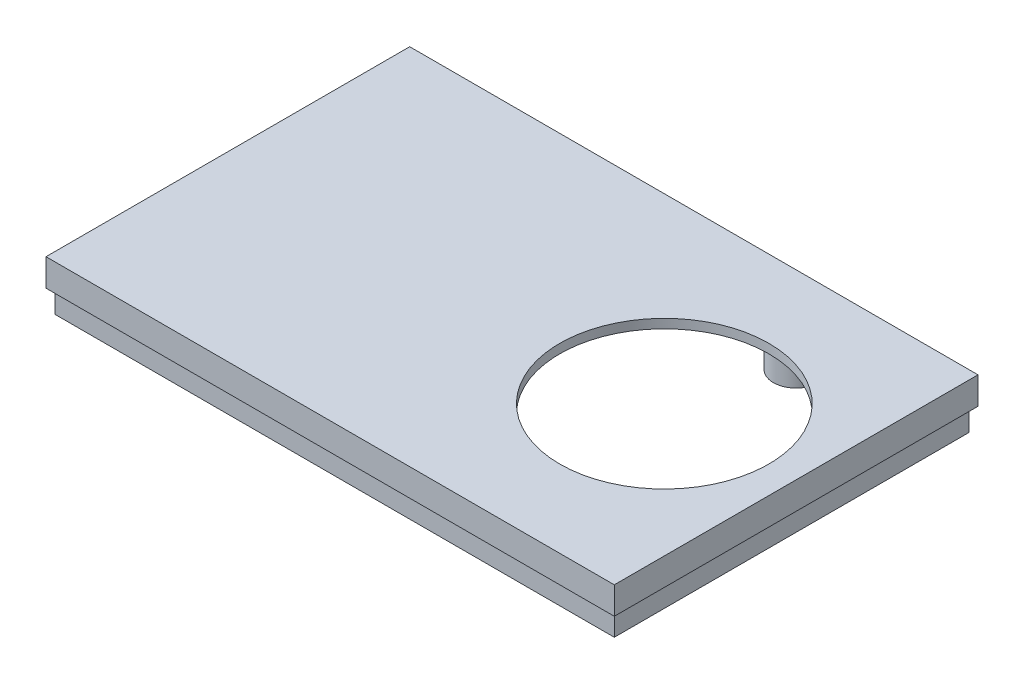
ISO-10303-21;
HEADER;
FILE_DESCRIPTION(('STEP AP214'),'2;1');
FILE_NAME('part.step','',(''),(''),'','','');
FILE_SCHEMA(('AUTOMOTIVE_DESIGN { 1 0 10303 214 1 1 1 1 }'));
ENDSEC;
DATA;
#1=APPLICATION_CONTEXT('core data for automotive mechanical design processes');
#2=APPLICATION_PROTOCOL_DEFINITION('international standard','automotive_design',2000,#1);
#3=PRODUCT_CONTEXT('',#1,'mechanical');
#4=PRODUCT('Part','Part','',(#3));
#5=PRODUCT_RELATED_PRODUCT_CATEGORY('part','',(#4));
#6=PRODUCT_DEFINITION_FORMATION('','',#4);
#7=PRODUCT_DEFINITION_CONTEXT('part definition',#1,'design');
#8=PRODUCT_DEFINITION('design','',#6,#7);
#9=PRODUCT_DEFINITION_SHAPE('','',#8);
#10=(LENGTH_UNIT() NAMED_UNIT(*) SI_UNIT(.MILLI.,.METRE.));
#11=(NAMED_UNIT(*) PLANE_ANGLE_UNIT() SI_UNIT($,.RADIAN.));
#12=(NAMED_UNIT(*) SI_UNIT($,.STERADIAN.) SOLID_ANGLE_UNIT());
#13=UNCERTAINTY_MEASURE_WITH_UNIT(LENGTH_MEASURE(1.E-05),#10,'distance_accuracy_value','');
#14=(GEOMETRIC_REPRESENTATION_CONTEXT(3) GLOBAL_UNCERTAINTY_ASSIGNED_CONTEXT((#13)) GLOBAL_UNIT_ASSIGNED_CONTEXT((#10,
#11,#12)) REPRESENTATION_CONTEXT('',''));
#15=CARTESIAN_POINT('',(0.,0.,0.));
#16=DIRECTION('',(0.,0.,1.));
#17=DIRECTION('',(1.,0.,0.));
#18=AXIS2_PLACEMENT_3D('',#15,#16,#17);
#19=CARTESIAN_POINT('',(-39.2790697674419,5.5,-6.65116279069767));
#20=DIRECTION('',(0.,0.,1.));
#21=DIRECTION('',(1.,0.,0.));
#22=AXIS2_PLACEMENT_3D('',#19,#20,#21);
#23=PLANE('',#22);
#24=DIRECTION('',(-1.,0.,0.));
#25=VECTOR('',#24,1.);
#26=CARTESIAN_POINT('',(22.7209302325581,2.5,-6.65116279069767));
#27=LINE('',#26,#25);
#28=CARTESIAN_POINT('',(22.2209302325581,2.5,-6.65116279069767));
#29=VERTEX_POINT('',#28);
#30=CARTESIAN_POINT('',(-39.2790697674419,2.5,-6.65116279069767));
#31=VERTEX_POINT('',#30);
#32=EDGE_CURVE('E58',#29,#31,#27,.T.);
#33=ORIENTED_EDGE('',*,*,#32,.F.);
#34=DIRECTION('',(0.,-1.,0.));
#35=VECTOR('',#34,1.);
#36=CARTESIAN_POINT('',(22.2209302325581,5.5,-6.65116279069767));
#37=LINE('',#36,#35);
#38=CARTESIAN_POINT('',(22.2209302325581,0.,-6.65116279069767));
#39=VERTEX_POINT('',#38);
#40=EDGE_CURVE('E222',#29,#39,#37,.T.);
#41=ORIENTED_EDGE('',*,*,#40,.T.);
#42=DIRECTION('',(-1.,0.,0.));
#43=VECTOR('',#42,1.);
#44=CARTESIAN_POINT('',(-39.2790697674419,0.,-6.65116279069767));
#45=LINE('',#44,#43);
#46=CARTESIAN_POINT('',(-39.2790697674419,0.,-6.65116279069767));
#47=VERTEX_POINT('',#46);
#48=EDGE_CURVE('E217',#39,#47,#45,.T.);
#49=ORIENTED_EDGE('',*,*,#48,.T.);
#50=DIRECTION('',(0.,-1.,0.));
#51=VECTOR('',#50,1.);
#52=CARTESIAN_POINT('',(-39.2790697674419,5.5,-6.65116279069767));
#53=LINE('',#52,#51);
#54=EDGE_CURVE('E220',#31,#47,#53,.T.);
#55=ORIENTED_EDGE('',*,*,#54,.F.);
#56=EDGE_LOOP('',(#33,#41,#49,#55));
#57=FACE_BOUND('',#56,.T.);
#58=ADVANCED_FACE('F35',(#57),#23,.F.);
#59=CARTESIAN_POINT('',(22.2209302325581,5.5,-6.65116279069767));
#60=DIRECTION('',(-1.,0.,0.));
#61=DIRECTION('',(0.,0.,1.));
#62=AXIS2_PLACEMENT_3D('',#59,#60,#61);
#63=PLANE('',#62);
#64=DIRECTION('',(0.,0.,-1.));
#65=VECTOR('',#64,1.);
#66=CARTESIAN_POINT('',(22.2209302325581,2.5,32.8488372093023));
#67=LINE('',#66,#65);
#68=CARTESIAN_POINT('',(22.2209302325581,2.5,32.3488372093023));
#69=VERTEX_POINT('',#68);
#70=EDGE_CURVE('E181',#69,#29,#67,.T.);
#71=ORIENTED_EDGE('',*,*,#70,.F.);
#72=DIRECTION('',(0.,-1.,0.));
#73=VECTOR('',#72,1.);
#74=CARTESIAN_POINT('',(22.2209302325581,5.5,32.3488372093023));
#75=LINE('',#74,#73);
#76=CARTESIAN_POINT('',(22.2209302325581,0.,32.3488372093023));
#77=VERTEX_POINT('',#76);
#78=EDGE_CURVE('E224',#69,#77,#75,.T.);
#79=ORIENTED_EDGE('',*,*,#78,.T.);
#80=DIRECTION('',(0.,0.,-1.));
#81=VECTOR('',#80,1.);
#82=CARTESIAN_POINT('',(22.2209302325581,0.,-6.65116279069767));
#83=LINE('',#82,#81);
#84=EDGE_CURVE('E214',#77,#39,#83,.T.);
#85=ORIENTED_EDGE('',*,*,#84,.T.);
#86=ORIENTED_EDGE('',*,*,#40,.F.);
#87=EDGE_LOOP('',(#71,#79,#85,#86));
#88=FACE_BOUND('',#87,.T.);
#89=ADVANCED_FACE('F293',(#88),#63,.F.);
#90=CARTESIAN_POINT('',(-39.2790697674419,5.5,32.3488372093023));
#91=DIRECTION('',(0.,0.,-1.));
#92=DIRECTION('',(-1.,0.,0.));
#93=AXIS2_PLACEMENT_3D('',#90,#91,#92);
#94=PLANE('',#93);
#95=DIRECTION('',(1.,0.,0.));
#96=VECTOR('',#95,1.);
#97=CARTESIAN_POINT('',(-39.7790697674419,2.5,32.3488372093023));
#98=LINE('',#97,#96);
#99=CARTESIAN_POINT('',(-39.2790697674419,2.5,32.3488372093023));
#100=VERTEX_POINT('',#99);
#101=EDGE_CURVE('E191',#100,#69,#98,.T.);
#102=ORIENTED_EDGE('',*,*,#101,.F.);
#103=DIRECTION('',(0.,-1.,0.));
#104=VECTOR('',#103,1.);
#105=CARTESIAN_POINT('',(-39.2790697674419,5.5,32.3488372093023));
#106=LINE('',#105,#104);
#107=CARTESIAN_POINT('',(-39.2790697674419,0.,32.3488372093023));
#108=VERTEX_POINT('',#107);
#109=EDGE_CURVE('E202',#100,#108,#106,.T.);
#110=ORIENTED_EDGE('',*,*,#109,.T.);
#111=DIRECTION('',(1.,0.,0.));
#112=VECTOR('',#111,1.);
#113=CARTESIAN_POINT('',(-39.2790697674419,0.,32.3488372093023));
#114=LINE('',#113,#112);
#115=EDGE_CURVE('E211',#108,#77,#114,.T.);
#116=ORIENTED_EDGE('',*,*,#115,.T.);
#117=ORIENTED_EDGE('',*,*,#78,.F.);
#118=EDGE_LOOP('',(#102,#110,#116,#117));
#119=FACE_BOUND('',#118,.T.);
#120=ADVANCED_FACE('F299',(#119),#94,.F.);
#121=CARTESIAN_POINT('',(-39.2790697674419,5.5,-6.65116279069767));
#122=DIRECTION('',(1.,0.,0.));
#123=DIRECTION('',(0.,0.,-1.));
#124=AXIS2_PLACEMENT_3D('',#121,#122,#123);
#125=PLANE('',#124);
#126=DIRECTION('',(0.,0.,1.));
#127=VECTOR('',#126,1.);
#128=CARTESIAN_POINT('',(-39.2790697674419,2.5,-6.65116279069766));
#129=LINE('',#128,#127);
#130=EDGE_CURVE('E199',#31,#100,#129,.T.);
#131=ORIENTED_EDGE('',*,*,#130,.F.);
#132=ORIENTED_EDGE('',*,*,#54,.T.);
#133=DIRECTION('',(0.,0.,1.));
#134=VECTOR('',#133,1.);
#135=CARTESIAN_POINT('',(-39.2790697674419,0.,-6.65116279069767));
#136=LINE('',#135,#134);
#137=EDGE_CURVE('E207',#47,#108,#136,.T.);
#138=ORIENTED_EDGE('',*,*,#137,.T.);
#139=ORIENTED_EDGE('',*,*,#109,.F.);
#140=EDGE_LOOP('',(#131,#132,#138,#139));
#141=FACE_BOUND('',#140,.T.);
#142=ADVANCED_FACE('F37',(#141),#125,.F.);
#143=CARTESIAN_POINT('',(0.,5.5,0.));
#144=DIRECTION('',(0.,1.,0.));
#145=DIRECTION('',(0.,0.,1.));
#146=AXIS2_PLACEMENT_3D('',#143,#144,#145);
#147=PLANE('',#146);
#148=CARTESIAN_POINT('',(8.22093023255814,5.5,12.8488372093023));
#149=DIRECTION('',(0.,1.,0.));
#150=DIRECTION('',(0.,0.,1.));
#151=AXIS2_PLACEMENT_3D('',#148,#149,#150);
#152=CIRCLE('',#151,11.5);
#153=CARTESIAN_POINT('',(8.22093023255814,5.5,24.3488372093023));
#154=VERTEX_POINT('',#153);
#155=EDGE_CURVE('E151',#154,#154,#152,.T.);
#156=ORIENTED_EDGE('',*,*,#155,.F.);
#157=EDGE_LOOP('',(#156));
#158=FACE_BOUND('',#157,.T.);
#159=DIRECTION('',(0.,0.,1.));
#160=VECTOR('',#159,1.);
#161=CARTESIAN_POINT('',(22.7209302325581,5.5,32.8488372093023));
#162=LINE('',#161,#160);
#163=CARTESIAN_POINT('',(22.7209302325581,5.5,-7.15116279069767));
#164=VERTEX_POINT('',#163);
#165=CARTESIAN_POINT('',(22.7209302325581,5.5,32.8488372093023));
#166=VERTEX_POINT('',#165);
#167=EDGE_CURVE('E186',#164,#166,#162,.T.);
#168=ORIENTED_EDGE('',*,*,#167,.F.);
#169=DIRECTION('',(1.,0.,0.));
#170=VECTOR('',#169,1.);
#171=CARTESIAN_POINT('',(22.7209302325581,5.5,-7.15116279069767));
#172=LINE('',#171,#170);
#173=CARTESIAN_POINT('',(-39.7790697674419,5.5,-7.15116279069767));
#174=VERTEX_POINT('',#173);
#175=EDGE_CURVE('E176',#174,#164,#172,.T.);
#176=ORIENTED_EDGE('',*,*,#175,.F.);
#177=DIRECTION('',(0.,0.,-1.));
#178=VECTOR('',#177,1.);
#179=CARTESIAN_POINT('',(-39.7790697674419,5.5,-6.65116279069766));
#180=LINE('',#179,#178);
#181=CARTESIAN_POINT('',(-39.7790697674419,5.5,32.8488372093023));
#182=VERTEX_POINT('',#181);
#183=EDGE_CURVE('E205',#182,#174,#180,.T.);
#184=ORIENTED_EDGE('',*,*,#183,.F.);
#185=DIRECTION('',(-1.,0.,0.));
#186=VECTOR('',#185,1.);
#187=CARTESIAN_POINT('',(-39.7790697674419,5.5,32.8488372093023));
#188=LINE('',#187,#186);
#189=EDGE_CURVE('E196',#166,#182,#188,.T.);
#190=ORIENTED_EDGE('',*,*,#189,.F.);
#191=EDGE_LOOP('',(#168,#176,#184,#190));
#192=FACE_BOUND('',#191,.T.);
#193=ADVANCED_FACE('F310',(#158,#192),#147,.T.);
#194=CARTESIAN_POINT('',(0.,0.,0.));
#195=DIRECTION('',(0.,1.,0.));
#196=DIRECTION('',(0.,0.,1.));
#197=AXIS2_PLACEMENT_3D('',#194,#195,#196);
#198=PLANE('',#197);
#199=DIRECTION('',(1.,0.,0.));
#200=VECTOR('',#199,1.);
#201=CARTESIAN_POINT('',(-38.7790697674419,0.,-6.15116279069767));
#202=LINE('',#201,#200);
#203=CARTESIAN_POINT('',(-38.7790697674419,0.,-6.15116279069767));
#204=VERTEX_POINT('',#203);
#205=CARTESIAN_POINT('',(21.7209302325581,0.,-6.15116279069767));
#206=VERTEX_POINT('',#205);
#207=EDGE_CURVE('E157',#204,#206,#202,.T.);
#208=ORIENTED_EDGE('',*,*,#207,.F.);
#209=DIRECTION('',(0.,0.,-1.));
#210=VECTOR('',#209,1.);
#211=CARTESIAN_POINT('',(-38.7790697674419,0.,31.8488372093023));
#212=LINE('',#211,#210);
#213=CARTESIAN_POINT('',(-38.7790697674419,0.,31.8488372093023));
#214=VERTEX_POINT('',#213);
#215=EDGE_CURVE('E50',#214,#204,#212,.T.);
#216=ORIENTED_EDGE('',*,*,#215,.F.);
#217=DIRECTION('',(-1.,0.,0.));
#218=VECTOR('',#217,1.);
#219=CARTESIAN_POINT('',(-38.7790697674419,0.,31.8488372093023));
#220=LINE('',#219,#218);
#221=CARTESIAN_POINT('',(21.7209302325581,0.,31.8488372093023));
#222=VERTEX_POINT('',#221);
#223=EDGE_CURVE('E145',#222,#214,#220,.T.);
#224=ORIENTED_EDGE('',*,*,#223,.F.);
#225=DIRECTION('',(0.,0.,1.));
#226=VECTOR('',#225,1.);
#227=CARTESIAN_POINT('',(21.7209302325581,0.,31.8488372093023));
#228=LINE('',#227,#226);
#229=EDGE_CURVE('E148',#206,#222,#228,.T.);
#230=ORIENTED_EDGE('',*,*,#229,.F.);
#231=EDGE_LOOP('',(#208,#216,#224,#230));
#232=FACE_BOUND('',#231,.T.);
#233=ORIENTED_EDGE('',*,*,#137,.F.);
#234=ORIENTED_EDGE('',*,*,#48,.F.);
#235=ORIENTED_EDGE('',*,*,#84,.F.);
#236=ORIENTED_EDGE('',*,*,#115,.F.);
#237=EDGE_LOOP('',(#233,#234,#235,#236));
#238=FACE_BOUND('',#237,.T.);
#239=ADVANCED_FACE('F303',(#232,#238),#198,.F.);
#240=CARTESIAN_POINT('',(-39.7790697674419,2.5,-6.65116279069766));
#241=DIRECTION('',(0.,1.,0.));
#242=DIRECTION('',(0.,0.,1.));
#243=AXIS2_PLACEMENT_3D('',#240,#241,#242);
#244=PLANE('',#243);
#245=ORIENTED_EDGE('',*,*,#70,.T.);
#246=ORIENTED_EDGE('',*,*,#32,.T.);
#247=ORIENTED_EDGE('',*,*,#130,.T.);
#248=ORIENTED_EDGE('',*,*,#101,.T.);
#249=EDGE_LOOP('',(#245,#246,#247,#248));
#250=FACE_BOUND('',#249,.T.);
#251=DIRECTION('',(-1.,0.,0.));
#252=VECTOR('',#251,1.);
#253=CARTESIAN_POINT('',(22.7209302325581,2.5,-7.15116279069767));
#254=LINE('',#253,#252);
#255=CARTESIAN_POINT('',(22.7209302325581,2.5,-7.15116279069767));
#256=VERTEX_POINT('',#255);
#257=CARTESIAN_POINT('',(-39.7790697674419,2.5,-7.15116279069767));
#258=VERTEX_POINT('',#257);
#259=EDGE_CURVE('E170',#256,#258,#254,.T.);
#260=ORIENTED_EDGE('',*,*,#259,.F.);
#261=DIRECTION('',(0.,0.,-1.));
#262=VECTOR('',#261,1.);
#263=CARTESIAN_POINT('',(22.7209302325581,2.5,32.8488372093023));
#264=LINE('',#263,#262);
#265=CARTESIAN_POINT('',(22.7209302325581,2.5,32.8488372093023));
#266=VERTEX_POINT('',#265);
#267=EDGE_CURVE('E184',#266,#256,#264,.T.);
#268=ORIENTED_EDGE('',*,*,#267,.F.);
#269=DIRECTION('',(1.,0.,0.));
#270=VECTOR('',#269,1.);
#271=CARTESIAN_POINT('',(-39.7790697674419,2.5,32.8488372093023));
#272=LINE('',#271,#270);
#273=CARTESIAN_POINT('',(-39.7790697674419,2.5,32.8488372093023));
#274=VERTEX_POINT('',#273);
#275=EDGE_CURVE('E194',#274,#266,#272,.T.);
#276=ORIENTED_EDGE('',*,*,#275,.F.);
#277=DIRECTION('',(0.,0.,1.));
#278=VECTOR('',#277,1.);
#279=CARTESIAN_POINT('',(-39.7790697674419,2.5,-6.65116279069766));
#280=LINE('',#279,#278);
#281=EDGE_CURVE('E203',#258,#274,#280,.T.);
#282=ORIENTED_EDGE('',*,*,#281,.F.);
#283=EDGE_LOOP('',(#260,#268,#276,#282));
#284=FACE_BOUND('',#283,.T.);
#285=ADVANCED_FACE('F317',(#250,#284),#244,.F.);
#286=CARTESIAN_POINT('',(-39.7790697674419,0.,0.));
#287=DIRECTION('',(-1.,0.,0.));
#288=DIRECTION('',(0.,0.,1.));
#289=AXIS2_PLACEMENT_3D('',#286,#287,#288);
#290=PLANE('',#289);
#291=ORIENTED_EDGE('',*,*,#183,.T.);
#292=DIRECTION('',(0.,1.,0.));
#293=VECTOR('',#292,1.);
#294=CARTESIAN_POINT('',(-39.7790697674419,5.5,-7.15116279069767));
#295=LINE('',#294,#293);
#296=EDGE_CURVE('E173',#258,#174,#295,.T.);
#297=ORIENTED_EDGE('',*,*,#296,.F.);
#298=ORIENTED_EDGE('',*,*,#281,.T.);
#299=DIRECTION('',(0.,-1.,0.));
#300=VECTOR('',#299,1.);
#301=CARTESIAN_POINT('',(-39.7790697674419,5.5,32.8488372093023));
#302=LINE('',#301,#300);
#303=EDGE_CURVE('E189',#182,#274,#302,.T.);
#304=ORIENTED_EDGE('',*,*,#303,.F.);
#305=EDGE_LOOP('',(#291,#297,#298,#304));
#306=FACE_BOUND('',#305,.T.);
#307=ADVANCED_FACE('F320',(#306),#290,.T.);
#308=CARTESIAN_POINT('',(0.,0.,32.8488372093023));
#309=DIRECTION('',(0.,0.,1.));
#310=DIRECTION('',(1.,0.,0.));
#311=AXIS2_PLACEMENT_3D('',#308,#309,#310);
#312=PLANE('',#311);
#313=ORIENTED_EDGE('',*,*,#303,.T.);
#314=ORIENTED_EDGE('',*,*,#275,.T.);
#315=DIRECTION('',(0.,-1.,0.));
#316=VECTOR('',#315,1.);
#317=CARTESIAN_POINT('',(22.7209302325581,5.5,32.8488372093023));
#318=LINE('',#317,#316);
#319=EDGE_CURVE('E179',#166,#266,#318,.T.);
#320=ORIENTED_EDGE('',*,*,#319,.F.);
#321=ORIENTED_EDGE('',*,*,#189,.T.);
#322=EDGE_LOOP('',(#313,#314,#320,#321));
#323=FACE_BOUND('',#322,.T.);
#324=ADVANCED_FACE('F334',(#323),#312,.T.);
#325=CARTESIAN_POINT('',(22.7209302325581,0.,0.));
#326=DIRECTION('',(1.,0.,0.));
#327=DIRECTION('',(0.,0.,-1.));
#328=AXIS2_PLACEMENT_3D('',#325,#326,#327);
#329=PLANE('',#328);
#330=ORIENTED_EDGE('',*,*,#319,.T.);
#331=ORIENTED_EDGE('',*,*,#267,.T.);
#332=DIRECTION('',(0.,-1.,0.));
#333=VECTOR('',#332,1.);
#334=CARTESIAN_POINT('',(22.7209302325581,5.5,-7.15116279069767));
#335=LINE('',#334,#333);
#336=EDGE_CURVE('E164',#164,#256,#335,.T.);
#337=ORIENTED_EDGE('',*,*,#336,.F.);
#338=ORIENTED_EDGE('',*,*,#167,.T.);
#339=EDGE_LOOP('',(#330,#331,#337,#338));
#340=FACE_BOUND('',#339,.T.);
#341=ADVANCED_FACE('F331',(#340),#329,.T.);
#342=CARTESIAN_POINT('',(0.,0.,-7.15116279069767));
#343=DIRECTION('',(0.,0.,-1.));
#344=DIRECTION('',(-1.,0.,0.));
#345=AXIS2_PLACEMENT_3D('',#342,#343,#344);
#346=PLANE('',#345);
#347=ORIENTED_EDGE('',*,*,#336,.T.);
#348=ORIENTED_EDGE('',*,*,#259,.T.);
#349=ORIENTED_EDGE('',*,*,#296,.T.);
#350=ORIENTED_EDGE('',*,*,#175,.T.);
#351=EDGE_LOOP('',(#347,#348,#349,#350));
#352=FACE_BOUND('',#351,.T.);
#353=ADVANCED_FACE('F328',(#352),#346,.T.);
#354=CARTESIAN_POINT('',(-38.7790697674419,4.5,31.8488372093023));
#355=DIRECTION('',(-1.,0.,0.));
#356=DIRECTION('',(0.,0.,1.));
#357=AXIS2_PLACEMENT_3D('',#354,#355,#356);
#358=PLANE('',#357);
#359=ORIENTED_EDGE('',*,*,#215,.T.);
#360=DIRECTION('',(0.,-1.,0.));
#361=VECTOR('',#360,1.);
#362=CARTESIAN_POINT('',(-38.7790697674419,4.5,-6.15116279069767));
#363=LINE('',#362,#361);
#364=CARTESIAN_POINT('',(-38.7790697674419,4.5,-6.15116279069767));
#365=VERTEX_POINT('',#364);
#366=EDGE_CURVE('E123',#365,#204,#363,.T.);
#367=ORIENTED_EDGE('',*,*,#366,.F.);
#368=DIRECTION('',(0.,0.,-1.));
#369=VECTOR('',#368,1.);
#370=CARTESIAN_POINT('',(-38.7790697674419,4.5,31.8488372093023));
#371=LINE('',#370,#369);
#372=CARTESIAN_POINT('',(-38.7790697674419,4.5,31.8488372093023));
#373=VERTEX_POINT('',#372);
#374=EDGE_CURVE('E127',#373,#365,#371,.T.);
#375=ORIENTED_EDGE('',*,*,#374,.F.);
#376=DIRECTION('',(0.,-1.,0.));
#377=VECTOR('',#376,1.);
#378=CARTESIAN_POINT('',(-38.7790697674419,4.5,31.8488372093023));
#379=LINE('',#378,#377);
#380=EDGE_CURVE('E162',#373,#214,#379,.T.);
#381=ORIENTED_EDGE('',*,*,#380,.T.);
#382=EDGE_LOOP('',(#359,#367,#375,#381));
#383=FACE_BOUND('',#382,.T.);
#384=ADVANCED_FACE('F125',(#383),#358,.F.);
#385=CARTESIAN_POINT('',(-38.7790697674419,4.5,31.8488372093023));
#386=DIRECTION('',(0.,0.,1.));
#387=DIRECTION('',(1.,0.,0.));
#388=AXIS2_PLACEMENT_3D('',#385,#386,#387);
#389=PLANE('',#388);
#390=ORIENTED_EDGE('',*,*,#223,.T.);
#391=ORIENTED_EDGE('',*,*,#380,.F.);
#392=DIRECTION('',(-1.,0.,0.));
#393=VECTOR('',#392,1.);
#394=CARTESIAN_POINT('',(-38.7790697674419,4.5,31.8488372093023));
#395=LINE('',#394,#393);
#396=CARTESIAN_POINT('',(21.7209302325581,4.5,31.8488372093023));
#397=VERTEX_POINT('',#396);
#398=EDGE_CURVE('E133',#397,#373,#395,.T.);
#399=ORIENTED_EDGE('',*,*,#398,.F.);
#400=DIRECTION('',(0.,-1.,0.));
#401=VECTOR('',#400,1.);
#402=CARTESIAN_POINT('',(21.7209302325581,4.5,31.8488372093023));
#403=LINE('',#402,#401);
#404=EDGE_CURVE('E165',#397,#222,#403,.T.);
#405=ORIENTED_EDGE('',*,*,#404,.T.);
#406=EDGE_LOOP('',(#390,#391,#399,#405));
#407=FACE_BOUND('',#406,.T.);
#408=ADVANCED_FACE('F354',(#407),#389,.F.);
#409=CARTESIAN_POINT('',(21.7209302325581,4.5,31.8488372093023));
#410=DIRECTION('',(1.,0.,0.));
#411=DIRECTION('',(0.,0.,-1.));
#412=AXIS2_PLACEMENT_3D('',#409,#410,#411);
#413=PLANE('',#412);
#414=ORIENTED_EDGE('',*,*,#229,.T.);
#415=ORIENTED_EDGE('',*,*,#404,.F.);
#416=DIRECTION('',(0.,0.,1.));
#417=VECTOR('',#416,1.);
#418=CARTESIAN_POINT('',(21.7209302325581,4.5,31.8488372093023));
#419=LINE('',#418,#417);
#420=CARTESIAN_POINT('',(21.7209302325581,4.5,-6.15116279069767));
#421=VERTEX_POINT('',#420);
#422=EDGE_CURVE('E141',#421,#397,#419,.T.);
#423=ORIENTED_EDGE('',*,*,#422,.F.);
#424=DIRECTION('',(0.,-1.,0.));
#425=VECTOR('',#424,1.);
#426=CARTESIAN_POINT('',(21.7209302325581,4.5,-6.15116279069767));
#427=LINE('',#426,#425);
#428=EDGE_CURVE('E132',#421,#206,#427,.T.);
#429=ORIENTED_EDGE('',*,*,#428,.T.);
#430=EDGE_LOOP('',(#414,#415,#423,#429));
#431=FACE_BOUND('',#430,.T.);
#432=ADVANCED_FACE('F357',(#431),#413,.F.);
#433=CARTESIAN_POINT('',(-38.7790697674419,4.5,-6.15116279069767));
#434=DIRECTION('',(0.,0.,-1.));
#435=DIRECTION('',(-1.,0.,0.));
#436=AXIS2_PLACEMENT_3D('',#433,#434,#435);
#437=PLANE('',#436);
#438=ORIENTED_EDGE('',*,*,#207,.T.);
#439=ORIENTED_EDGE('',*,*,#428,.F.);
#440=DIRECTION('',(1.,0.,0.));
#441=VECTOR('',#440,1.);
#442=CARTESIAN_POINT('',(-38.7790697674419,4.5,-6.15116279069767));
#443=LINE('',#442,#441);
#444=EDGE_CURVE('E136',#365,#421,#443,.T.);
#445=ORIENTED_EDGE('',*,*,#444,.F.);
#446=ORIENTED_EDGE('',*,*,#366,.T.);
#447=EDGE_LOOP('',(#438,#439,#445,#446));
#448=FACE_BOUND('',#447,.T.);
#449=ADVANCED_FACE('F137',(#448),#437,.F.);
#450=CARTESIAN_POINT('',(0.,4.5,0.));
#451=DIRECTION('',(0.,-1.,0.));
#452=DIRECTION('',(0.,0.,-1.));
#453=AXIS2_PLACEMENT_3D('',#450,#451,#452);
#454=PLANE('',#453);
#455=CARTESIAN_POINT('',(8.22093023255813,4.5,-1.65116279069766));
#456=DIRECTION('',(0.,-1.,0.));
#457=DIRECTION('',(0.,0.,-1.));
#458=AXIS2_PLACEMENT_3D('',#455,#456,#457);
#459=CIRCLE('',#458,2.5);
#460=CARTESIAN_POINT('',(8.22093023255813,4.5,-4.15116279069766));
#461=VERTEX_POINT('',#460);
#462=EDGE_CURVE('E11',#461,#461,#459,.T.);
#463=ORIENTED_EDGE('',*,*,#462,.F.);
#464=EDGE_LOOP('',(#463));
#465=FACE_BOUND('',#464,.T.);
#466=CARTESIAN_POINT('',(8.22093023255813,4.5,27.3488372093023));
#467=DIRECTION('',(0.,-1.,0.));
#468=DIRECTION('',(0.,0.,-1.));
#469=AXIS2_PLACEMENT_3D('',#466,#467,#468);
#470=CIRCLE('',#469,2.5);
#471=CARTESIAN_POINT('',(8.22093023255813,4.5,24.8488372093023));
#472=VERTEX_POINT('',#471);
#473=EDGE_CURVE('E43',#472,#472,#470,.T.);
#474=ORIENTED_EDGE('',*,*,#473,.F.);
#475=EDGE_LOOP('',(#474));
#476=FACE_BOUND('',#475,.T.);
#477=CARTESIAN_POINT('',(8.22093023255814,4.5,12.8488372093023));
#478=DIRECTION('',(0.,-1.,0.));
#479=DIRECTION('',(0.,0.,-1.));
#480=AXIS2_PLACEMENT_3D('',#477,#478,#479);
#481=CIRCLE('',#480,11.5);
#482=CARTESIAN_POINT('',(8.22093023255814,4.5,1.34883720930234));
#483=VERTEX_POINT('',#482);
#484=EDGE_CURVE('E158',#483,#483,#481,.T.);
#485=ORIENTED_EDGE('',*,*,#484,.F.);
#486=EDGE_LOOP('',(#485));
#487=FACE_BOUND('',#486,.T.);
#488=ORIENTED_EDGE('',*,*,#374,.T.);
#489=ORIENTED_EDGE('',*,*,#444,.T.);
#490=ORIENTED_EDGE('',*,*,#422,.T.);
#491=ORIENTED_EDGE('',*,*,#398,.T.);
#492=EDGE_LOOP('',(#488,#489,#490,#491));
#493=FACE_BOUND('',#492,.T.);
#494=ADVANCED_FACE('F143',(#465,#476,#487,#493),#454,.T.);
#495=CARTESIAN_POINT('',(8.22093023255814,-6.49999999999999,12.8488372093023));
#496=DIRECTION('',(0.,1.,0.));
#497=DIRECTION('',(0.,0.,1.));
#498=AXIS2_PLACEMENT_3D('',#495,#496,#497);
#499=CYLINDRICAL_SURFACE('',#498,11.5);
#500=ORIENTED_EDGE('',*,*,#484,.T.);
#501=EDGE_LOOP('',(#500));
#502=FACE_BOUND('',#501,.T.);
#503=ORIENTED_EDGE('',*,*,#155,.T.);
#504=EDGE_LOOP('',(#503));
#505=FACE_BOUND('',#504,.T.);
#506=ADVANCED_FACE('F236',(#502,#505),#499,.F.);
#507=CARTESIAN_POINT('',(8.22093023255813,1.5,27.3488372093023));
#508=DIRECTION('',(0.,1.,0.));
#509=DIRECTION('',(0.,0.,1.));
#510=AXIS2_PLACEMENT_3D('',#507,#508,#509);
#511=CYLINDRICAL_SURFACE('',#510,2.5);
#512=ORIENTED_EDGE('',*,*,#473,.T.);
#513=EDGE_LOOP('',(#512));
#514=FACE_BOUND('',#513,.T.);
#515=CARTESIAN_POINT('',(8.22093023255813,1.5,27.3488372093023));
#516=DIRECTION('',(0.,1.,0.));
#517=DIRECTION('',(0.,0.,1.));
#518=AXIS2_PLACEMENT_3D('',#515,#516,#517);
#519=CIRCLE('',#518,2.5);
#520=CARTESIAN_POINT('',(8.22093023255813,1.5,29.8488372093023));
#521=VERTEX_POINT('',#520);
#522=EDGE_CURVE('E247',#521,#521,#519,.T.);
#523=ORIENTED_EDGE('',*,*,#522,.T.);
#524=EDGE_LOOP('',(#523));
#525=FACE_BOUND('',#524,.T.);
#526=ADVANCED_FACE('F231',(#514,#525),#511,.T.);
#527=CARTESIAN_POINT('',(8.22093023255813,1.5,27.3488372093023));
#528=DIRECTION('',(0.,1.,0.));
#529=DIRECTION('',(0.,0.,1.));
#530=AXIS2_PLACEMENT_3D('',#527,#528,#529);
#531=PLANE('',#530);
#532=CARTESIAN_POINT('',(8.22093023255813,1.5,27.3488372093023));
#533=DIRECTION('',(0.,-1.,0.));
#534=DIRECTION('',(0.,0.,-1.));
#535=AXIS2_PLACEMENT_3D('',#532,#533,#534);
#536=CIRCLE('',#535,1.);
#537=CARTESIAN_POINT('',(8.22093023255813,1.5,26.3488372093023));
#538=VERTEX_POINT('',#537);
#539=EDGE_CURVE('E255',#538,#538,#536,.T.);
#540=ORIENTED_EDGE('',*,*,#539,.F.);
#541=EDGE_LOOP('',(#540));
#542=FACE_BOUND('',#541,.T.);
#543=ORIENTED_EDGE('',*,*,#522,.F.);
#544=EDGE_LOOP('',(#543));
#545=FACE_BOUND('',#544,.T.);
#546=ADVANCED_FACE('F283',(#542,#545),#531,.F.);
#547=CARTESIAN_POINT('',(8.22093023255813,1.5,-1.65116279069766));
#548=DIRECTION('',(0.,1.,0.));
#549=DIRECTION('',(0.,0.,1.));
#550=AXIS2_PLACEMENT_3D('',#547,#548,#549);
#551=CYLINDRICAL_SURFACE('',#550,2.5);
#552=ORIENTED_EDGE('',*,*,#462,.T.);
#553=EDGE_LOOP('',(#552));
#554=FACE_BOUND('',#553,.T.);
#555=CARTESIAN_POINT('',(8.22093023255813,1.5,-1.65116279069766));
#556=DIRECTION('',(0.,1.,0.));
#557=DIRECTION('',(0.,0.,1.));
#558=AXIS2_PLACEMENT_3D('',#555,#556,#557);
#559=CIRCLE('',#558,2.5);
#560=CARTESIAN_POINT('',(8.22093023255813,1.5,0.848837209302338));
#561=VERTEX_POINT('',#560);
#562=EDGE_CURVE('E249',#561,#561,#559,.T.);
#563=ORIENTED_EDGE('',*,*,#562,.T.);
#564=EDGE_LOOP('',(#563));
#565=FACE_BOUND('',#564,.T.);
#566=ADVANCED_FACE('F278',(#554,#565),#551,.T.);
#567=CARTESIAN_POINT('',(8.22093023255813,1.5,-1.65116279069766));
#568=DIRECTION('',(0.,1.,0.));
#569=DIRECTION('',(0.,0.,1.));
#570=AXIS2_PLACEMENT_3D('',#567,#568,#569);
#571=PLANE('',#570);
#572=CARTESIAN_POINT('',(8.22093023255813,1.5,-1.65116279069766));
#573=DIRECTION('',(0.,-1.,0.));
#574=DIRECTION('',(0.,0.,-1.));
#575=AXIS2_PLACEMENT_3D('',#572,#573,#574);
#576=CIRCLE('',#575,1.00324639697943);
#577=CARTESIAN_POINT('',(8.22093023255813,1.5,-2.65440918767709));
#578=VERTEX_POINT('',#577);
#579=EDGE_CURVE('E261',#578,#578,#576,.T.);
#580=ORIENTED_EDGE('',*,*,#579,.F.);
#581=EDGE_LOOP('',(#580));
#582=FACE_BOUND('',#581,.T.);
#583=ORIENTED_EDGE('',*,*,#562,.F.);
#584=EDGE_LOOP('',(#583));
#585=FACE_BOUND('',#584,.T.);
#586=ADVANCED_FACE('F272',(#582,#585),#571,.F.);
#587=CARTESIAN_POINT('',(8.22093023255813,4.5,-1.65116279069766));
#588=DIRECTION('',(0.,-1.,0.));
#589=DIRECTION('',(0.,0.,-1.));
#590=AXIS2_PLACEMENT_3D('',#587,#588,#589);
#591=CYLINDRICAL_SURFACE('',#590,1.00324639697943);
#592=CARTESIAN_POINT('',(8.22093023255813,4.5,-1.65116279069766));
#593=DIRECTION('',(0.,-1.,0.));
#594=DIRECTION('',(0.,0.,-1.));
#595=AXIS2_PLACEMENT_3D('',#592,#593,#594);
#596=CIRCLE('',#595,1.00324639697943);
#597=CARTESIAN_POINT('',(8.22093023255813,4.5,-2.65440918767709));
#598=VERTEX_POINT('',#597);
#599=EDGE_CURVE('E252',#598,#598,#596,.T.);
#600=ORIENTED_EDGE('',*,*,#599,.F.);
#601=EDGE_LOOP('',(#600));
#602=FACE_BOUND('',#601,.T.);
#603=ORIENTED_EDGE('',*,*,#579,.T.);
#604=EDGE_LOOP('',(#603));
#605=FACE_BOUND('',#604,.T.);
#606=ADVANCED_FACE('F269',(#602,#605),#591,.F.);
#607=CARTESIAN_POINT('',(8.22093023255813,4.5,-1.65116279069766));
#608=DIRECTION('',(0.,-1.,0.));
#609=DIRECTION('',(0.,0.,-1.));
#610=AXIS2_PLACEMENT_3D('',#607,#608,#609);
#611=PLANE('',#610);
#612=ORIENTED_EDGE('',*,*,#599,.T.);
#613=EDGE_LOOP('',(#612));
#614=FACE_BOUND('',#613,.T.);
#615=ADVANCED_FACE('F267',(#614),#611,.T.);
#616=CARTESIAN_POINT('',(8.22093023255813,4.5,27.3488372093023));
#617=DIRECTION('',(0.,-1.,0.));
#618=DIRECTION('',(0.,0.,-1.));
#619=AXIS2_PLACEMENT_3D('',#616,#617,#618);
#620=CYLINDRICAL_SURFACE('',#619,1.);
#621=CARTESIAN_POINT('',(8.22093023255813,4.5,27.3488372093023));
#622=DIRECTION('',(0.,-1.,0.));
#623=DIRECTION('',(0.,0.,-1.));
#624=AXIS2_PLACEMENT_3D('',#621,#622,#623);
#625=CIRCLE('',#624,1.);
#626=CARTESIAN_POINT('',(8.22093023255813,4.5,26.3488372093023));
#627=VERTEX_POINT('',#626);
#628=EDGE_CURVE('E258',#627,#627,#625,.T.);
#629=ORIENTED_EDGE('',*,*,#628,.F.);
#630=EDGE_LOOP('',(#629));
#631=FACE_BOUND('',#630,.T.);
#632=ORIENTED_EDGE('',*,*,#539,.T.);
#633=EDGE_LOOP('',(#632));
#634=FACE_BOUND('',#633,.T.);
#635=ADVANCED_FACE('F397',(#631,#634),#620,.F.);
#636=CARTESIAN_POINT('',(8.22093023255813,4.5,27.3488372093023));
#637=DIRECTION('',(0.,-1.,0.));
#638=DIRECTION('',(0.,0.,-1.));
#639=AXIS2_PLACEMENT_3D('',#636,#637,#638);
#640=PLANE('',#639);
#641=ORIENTED_EDGE('',*,*,#628,.T.);
#642=EDGE_LOOP('',(#641));
#643=FACE_BOUND('',#642,.T.);
#644=ADVANCED_FACE('F406',(#643),#640,.T.);
#645=CLOSED_SHELL('',(#58,#89,#120,#142,#193,#239,#285,#307,#324,#341,#353,#384,#408,#432,#449,
#494,#506,#526,#546,#566,#586,#606,#615,#635,#644));
#646=MANIFOLD_SOLID_BREP('B2',#645);
#647=ADVANCED_BREP_SHAPE_REPRESENTATION('',(#18,#646),#14);
#648=SHAPE_DEFINITION_REPRESENTATION(#9,#647);
ENDSEC;
END-ISO-10303-21;
